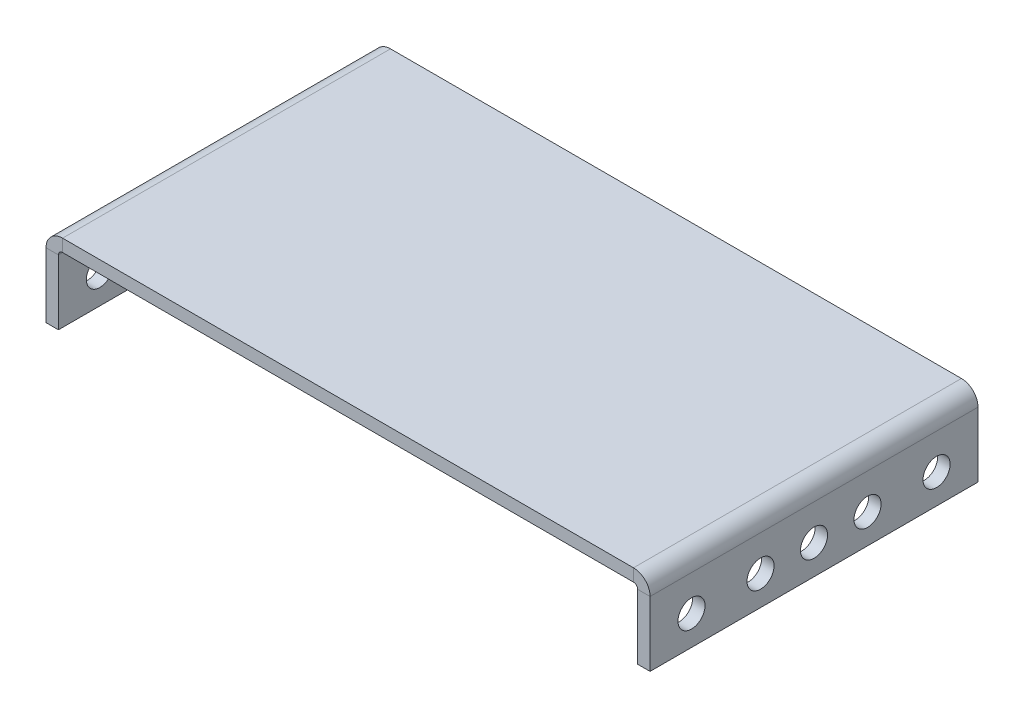
ISO-10303-21;
HEADER;
FILE_DESCRIPTION(('STEP AP214'),'2;1');
FILE_NAME('part.step','',(''),(''),'','','');
FILE_SCHEMA(('AUTOMOTIVE_DESIGN { 1 0 10303 214 1 1 1 1 }'));
ENDSEC;
DATA;
#1=APPLICATION_CONTEXT('core data for automotive mechanical design processes');
#2=APPLICATION_PROTOCOL_DEFINITION('international standard','automotive_design',2000,#1);
#3=PRODUCT_CONTEXT('',#1,'mechanical');
#4=PRODUCT('Part','Part','',(#3));
#5=PRODUCT_RELATED_PRODUCT_CATEGORY('part','',(#4));
#6=PRODUCT_DEFINITION_FORMATION('','',#4);
#7=PRODUCT_DEFINITION_CONTEXT('part definition',#1,'design');
#8=PRODUCT_DEFINITION('design','',#6,#7);
#9=PRODUCT_DEFINITION_SHAPE('','',#8);
#10=(LENGTH_UNIT() NAMED_UNIT(*) SI_UNIT(.MILLI.,.METRE.));
#11=(NAMED_UNIT(*) PLANE_ANGLE_UNIT() SI_UNIT($,.RADIAN.));
#12=(NAMED_UNIT(*) SI_UNIT($,.STERADIAN.) SOLID_ANGLE_UNIT());
#13=UNCERTAINTY_MEASURE_WITH_UNIT(LENGTH_MEASURE(1.E-05),#10,'distance_accuracy_value','');
#14=(GEOMETRIC_REPRESENTATION_CONTEXT(3) GLOBAL_UNCERTAINTY_ASSIGNED_CONTEXT((#13)) GLOBAL_UNIT_ASSIGNED_CONTEXT((#10,
#11,#12)) REPRESENTATION_CONTEXT('',''));
#15=CARTESIAN_POINT('',(0.,0.,0.));
#16=DIRECTION('',(0.,0.,1.));
#17=DIRECTION('',(1.,0.,0.));
#18=AXIS2_PLACEMENT_3D('',#15,#16,#17);
#19=CARTESIAN_POINT('',(52.5145,6.34999999999999,60.325));
#20=DIRECTION('',(0.,0.,1.));
#21=DIRECTION('',(1.,0.,0.));
#22=AXIS2_PLACEMENT_3D('',#19,#20,#21);
#23=PLANE('',#22);
#24=DIRECTION('',(0.,1.,0.));
#25=VECTOR('',#24,1.);
#26=CARTESIAN_POINT('',(52.5145,6.34999999999999,60.325));
#27=LINE('',#26,#25);
#28=CARTESIAN_POINT('',(52.5145,6.34999999999999,60.325));
#29=VERTEX_POINT('',#28);
#30=CARTESIAN_POINT('',(52.5145,8.63599999999999,60.325));
#31=VERTEX_POINT('',#30);
#32=EDGE_CURVE('E11',#29,#31,#27,.T.);
#33=ORIENTED_EDGE('',*,*,#32,.F.);
#34=CARTESIAN_POINT('',(52.5145,5.58799999999999,60.325));
#35=DIRECTION('',(0.,0.,-1.));
#36=DIRECTION('',(-1.,0.,0.));
#37=AXIS2_PLACEMENT_3D('',#34,#35,#36);
#38=CIRCLE('',#37,0.762);
#39=CARTESIAN_POINT('',(53.2765,5.58799999999999,60.325));
#40=VERTEX_POINT('',#39);
#41=EDGE_CURVE('E252',#40,#29,#38,.F.);
#42=ORIENTED_EDGE('',*,*,#41,.F.);
#43=DIRECTION('',(-1.,0.,0.));
#44=VECTOR('',#43,1.);
#45=CARTESIAN_POINT('',(55.5625,5.58799999999999,60.325));
#46=LINE('',#45,#44);
#47=CARTESIAN_POINT('',(55.5625,5.58799999999999,60.325));
#48=VERTEX_POINT('',#47);
#49=EDGE_CURVE('E49',#48,#40,#46,.T.);
#50=ORIENTED_EDGE('',*,*,#49,.F.);
#51=CARTESIAN_POINT('',(52.5145,5.58799999999999,60.325));
#52=DIRECTION('',(0.,0.,1.));
#53=DIRECTION('',(1.,0.,0.));
#54=AXIS2_PLACEMENT_3D('',#51,#52,#53);
#55=CIRCLE('',#54,3.048);
#56=EDGE_CURVE('E150',#48,#31,#55,.T.);
#57=ORIENTED_EDGE('',*,*,#56,.T.);
#58=EDGE_LOOP('',(#33,#42,#50,#57));
#59=FACE_BOUND('',#58,.T.);
#60=ADVANCED_FACE('F41',(#59),#23,.T.);
#61=CARTESIAN_POINT('',(55.5625,5.58799999999999,60.325));
#62=DIRECTION('',(0.,0.,1.));
#63=DIRECTION('',(1.,0.,0.));
#64=AXIS2_PLACEMENT_3D('',#61,#62,#63);
#65=PLANE('',#64);
#66=DIRECTION('',(-1.,0.,0.));
#67=VECTOR('',#66,1.);
#68=CARTESIAN_POINT('',(-53.2765,6.35,60.325));
#69=LINE('',#68,#67);
#70=CARTESIAN_POINT('',(-52.5145,6.35,60.325));
#71=VERTEX_POINT('',#70);
#72=EDGE_CURVE('E144',#29,#71,#69,.T.);
#73=ORIENTED_EDGE('',*,*,#72,.F.);
#74=ORIENTED_EDGE('',*,*,#32,.T.);
#75=DIRECTION('',(-1.,0.,0.));
#76=VECTOR('',#75,1.);
#77=CARTESIAN_POINT('',(-53.2765,8.636,60.325));
#78=LINE('',#77,#76);
#79=CARTESIAN_POINT('',(-52.5145,8.636,60.325));
#80=VERTEX_POINT('',#79);
#81=EDGE_CURVE('E141',#31,#80,#78,.T.);
#82=ORIENTED_EDGE('',*,*,#81,.T.);
#83=DIRECTION('',(0.,-1.,0.));
#84=VECTOR('',#83,1.);
#85=CARTESIAN_POINT('',(-52.5145,8.636,60.325));
#86=LINE('',#85,#84);
#87=EDGE_CURVE('E233',#80,#71,#86,.T.);
#88=ORIENTED_EDGE('',*,*,#87,.T.);
#89=EDGE_LOOP('',(#73,#74,#82,#88));
#90=FACE_BOUND('',#89,.T.);
#91=ADVANCED_FACE('F139',(#90),#65,.T.);
#92=CARTESIAN_POINT('',(53.2765,5.58799999999999,0.));
#93=DIRECTION('',(0.,0.,-1.));
#94=DIRECTION('',(-1.,0.,0.));
#95=AXIS2_PLACEMENT_3D('',#92,#93,#94);
#96=PLANE('',#95);
#97=DIRECTION('',(1.,0.,0.));
#98=VECTOR('',#97,1.);
#99=CARTESIAN_POINT('',(53.2765,5.58799999999999,0.));
#100=LINE('',#99,#98);
#101=CARTESIAN_POINT('',(53.2765,5.58799999999999,0.));
#102=VERTEX_POINT('',#101);
#103=CARTESIAN_POINT('',(55.5625,5.58799999999999,0.));
#104=VERTEX_POINT('',#103);
#105=EDGE_CURVE('E238',#102,#104,#100,.T.);
#106=ORIENTED_EDGE('',*,*,#105,.F.);
#107=CARTESIAN_POINT('',(52.5145,5.58799999999999,0.));
#108=DIRECTION('',(0.,0.,-1.));
#109=DIRECTION('',(-1.,0.,0.));
#110=AXIS2_PLACEMENT_3D('',#107,#108,#109);
#111=CIRCLE('',#110,0.762);
#112=CARTESIAN_POINT('',(52.5145,6.34999999999999,0.));
#113=VERTEX_POINT('',#112);
#114=EDGE_CURVE('E190',#102,#113,#111,.F.);
#115=ORIENTED_EDGE('',*,*,#114,.T.);
#116=DIRECTION('',(0.,-1.,0.));
#117=VECTOR('',#116,1.);
#118=CARTESIAN_POINT('',(52.5145,8.63599999999999,0.));
#119=LINE('',#118,#117);
#120=CARTESIAN_POINT('',(52.5145,8.63599999999999,0.));
#121=VERTEX_POINT('',#120);
#122=EDGE_CURVE('E236',#121,#113,#119,.T.);
#123=ORIENTED_EDGE('',*,*,#122,.F.);
#124=CARTESIAN_POINT('',(52.5145,5.58799999999999,0.));
#125=DIRECTION('',(0.,0.,1.));
#126=DIRECTION('',(1.,0.,0.));
#127=AXIS2_PLACEMENT_3D('',#124,#125,#126);
#128=CIRCLE('',#127,3.048);
#129=EDGE_CURVE('E162',#104,#121,#128,.T.);
#130=ORIENTED_EDGE('',*,*,#129,.F.);
#131=EDGE_LOOP('',(#106,#115,#123,#130));
#132=FACE_BOUND('',#131,.T.);
#133=ADVANCED_FACE('F360',(#132),#96,.T.);
#134=CARTESIAN_POINT('',(52.5145,8.63599999999999,0.));
#135=DIRECTION('',(0.,0.,-1.));
#136=DIRECTION('',(-1.,0.,0.));
#137=AXIS2_PLACEMENT_3D('',#134,#135,#136);
#138=PLANE('',#137);
#139=DIRECTION('',(0.,1.,0.));
#140=VECTOR('',#139,1.);
#141=CARTESIAN_POINT('',(53.2765,6.34999999999999,0.));
#142=LINE('',#141,#140);
#143=CARTESIAN_POINT('',(53.2765,-6.34999999999999,0.));
#144=VERTEX_POINT('',#143);
#145=EDGE_CURVE('E193',#144,#102,#142,.T.);
#146=ORIENTED_EDGE('',*,*,#145,.T.);
#147=ORIENTED_EDGE('',*,*,#105,.T.);
#148=DIRECTION('',(0.,1.,0.));
#149=VECTOR('',#148,1.);
#150=CARTESIAN_POINT('',(55.5625,6.34999999999999,0.));
#151=LINE('',#150,#149);
#152=CARTESIAN_POINT('',(55.5625,-6.34999999999999,0.));
#153=VERTEX_POINT('',#152);
#154=EDGE_CURVE('E199',#153,#104,#151,.T.);
#155=ORIENTED_EDGE('',*,*,#154,.F.);
#156=DIRECTION('',(-1.,0.,0.));
#157=VECTOR('',#156,1.);
#158=CARTESIAN_POINT('',(55.5625,-6.34999999999999,0.));
#159=LINE('',#158,#157);
#160=EDGE_CURVE('E196',#153,#144,#159,.T.);
#161=ORIENTED_EDGE('',*,*,#160,.T.);
#162=EDGE_LOOP('',(#146,#147,#155,#161));
#163=FACE_BOUND('',#162,.T.);
#164=ADVANCED_FACE('F364',(#163),#138,.T.);
#165=CARTESIAN_POINT('',(-53.2765,5.588,60.325));
#166=DIRECTION('',(0.,0.,1.));
#167=DIRECTION('',(1.,0.,0.));
#168=AXIS2_PLACEMENT_3D('',#165,#166,#167);
#169=PLANE('',#168);
#170=DIRECTION('',(-1.,0.,0.));
#171=VECTOR('',#170,1.);
#172=CARTESIAN_POINT('',(-53.2765,5.588,60.325));
#173=LINE('',#172,#171);
#174=CARTESIAN_POINT('',(-53.2765,5.588,60.325));
#175=VERTEX_POINT('',#174);
#176=CARTESIAN_POINT('',(-55.5625,5.588,60.325));
#177=VERTEX_POINT('',#176);
#178=EDGE_CURVE('E57',#175,#177,#173,.T.);
#179=ORIENTED_EDGE('',*,*,#178,.F.);
#180=CARTESIAN_POINT('',(-52.5145,5.588,60.325));
#181=DIRECTION('',(0.,0.,-1.));
#182=DIRECTION('',(-1.,0.,0.));
#183=AXIS2_PLACEMENT_3D('',#180,#181,#182);
#184=CIRCLE('',#183,0.762);
#185=EDGE_CURVE('E262',#71,#175,#184,.F.);
#186=ORIENTED_EDGE('',*,*,#185,.F.);
#187=ORIENTED_EDGE('',*,*,#87,.F.);
#188=CARTESIAN_POINT('',(-52.5145,5.588,60.325));
#189=DIRECTION('',(0.,0.,1.));
#190=DIRECTION('',(1.,0.,0.));
#191=AXIS2_PLACEMENT_3D('',#188,#189,#190);
#192=CIRCLE('',#191,3.048);
#193=EDGE_CURVE('E170',#80,#177,#192,.T.);
#194=ORIENTED_EDGE('',*,*,#193,.T.);
#195=EDGE_LOOP('',(#179,#186,#187,#194));
#196=FACE_BOUND('',#195,.T.);
#197=ADVANCED_FACE('F370',(#196),#169,.T.);
#198=CARTESIAN_POINT('',(-52.5145,8.636,60.325));
#199=DIRECTION('',(0.,0.,1.));
#200=DIRECTION('',(1.,0.,0.));
#201=AXIS2_PLACEMENT_3D('',#198,#199,#200);
#202=PLANE('',#201);
#203=DIRECTION('',(0.,-1.,0.));
#204=VECTOR('',#203,1.);
#205=CARTESIAN_POINT('',(-53.2765,6.35,60.325));
#206=LINE('',#205,#204);
#207=CARTESIAN_POINT('',(-53.2765,-6.35,60.325));
#208=VERTEX_POINT('',#207);
#209=EDGE_CURVE('E265',#175,#208,#206,.T.);
#210=ORIENTED_EDGE('',*,*,#209,.F.);
#211=ORIENTED_EDGE('',*,*,#178,.T.);
#212=DIRECTION('',(0.,1.,0.));
#213=VECTOR('',#212,1.);
#214=CARTESIAN_POINT('',(-55.5625,6.35,60.325));
#215=LINE('',#214,#213);
#216=CARTESIAN_POINT('',(-55.5625,-6.35,60.325));
#217=VERTEX_POINT('',#216);
#218=EDGE_CURVE('E111',#177,#217,#215,.F.);
#219=ORIENTED_EDGE('',*,*,#218,.T.);
#220=DIRECTION('',(-1.,0.,0.));
#221=VECTOR('',#220,1.);
#222=CARTESIAN_POINT('',(-53.2765,-6.35,60.325));
#223=LINE('',#222,#221);
#224=EDGE_CURVE('E268',#208,#217,#223,.T.);
#225=ORIENTED_EDGE('',*,*,#224,.F.);
#226=EDGE_LOOP('',(#210,#211,#219,#225));
#227=FACE_BOUND('',#226,.T.);
#228=ADVANCED_FACE('F374',(#227),#202,.T.);
#229=CARTESIAN_POINT('',(-52.5145,6.35,0.));
#230=DIRECTION('',(0.,0.,-1.));
#231=DIRECTION('',(-1.,0.,0.));
#232=AXIS2_PLACEMENT_3D('',#229,#230,#231);
#233=PLANE('',#232);
#234=DIRECTION('',(0.,1.,0.));
#235=VECTOR('',#234,1.);
#236=CARTESIAN_POINT('',(-52.5145,6.35,0.));
#237=LINE('',#236,#235);
#238=CARTESIAN_POINT('',(-52.5145,6.35,0.));
#239=VERTEX_POINT('',#238);
#240=CARTESIAN_POINT('',(-52.5145,8.636,0.));
#241=VERTEX_POINT('',#240);
#242=EDGE_CURVE('E98',#239,#241,#237,.T.);
#243=ORIENTED_EDGE('',*,*,#242,.F.);
#244=CARTESIAN_POINT('',(-52.5145,5.588,0.));
#245=DIRECTION('',(0.,0.,-1.));
#246=DIRECTION('',(-1.,0.,0.));
#247=AXIS2_PLACEMENT_3D('',#244,#245,#246);
#248=CIRCLE('',#247,0.762);
#249=CARTESIAN_POINT('',(-53.2765,5.588,0.));
#250=VERTEX_POINT('',#249);
#251=EDGE_CURVE('E186',#239,#250,#248,.F.);
#252=ORIENTED_EDGE('',*,*,#251,.T.);
#253=DIRECTION('',(1.,0.,0.));
#254=VECTOR('',#253,1.);
#255=CARTESIAN_POINT('',(-55.5625,5.588,0.));
#256=LINE('',#255,#254);
#257=CARTESIAN_POINT('',(-55.5625,5.588,0.));
#258=VERTEX_POINT('',#257);
#259=EDGE_CURVE('E105',#258,#250,#256,.T.);
#260=ORIENTED_EDGE('',*,*,#259,.F.);
#261=CARTESIAN_POINT('',(-52.5145,5.588,0.));
#262=DIRECTION('',(0.,0.,1.));
#263=DIRECTION('',(1.,0.,0.));
#264=AXIS2_PLACEMENT_3D('',#261,#262,#263);
#265=CIRCLE('',#264,3.048);
#266=EDGE_CURVE('E205',#241,#258,#265,.T.);
#267=ORIENTED_EDGE('',*,*,#266,.F.);
#268=EDGE_LOOP('',(#243,#252,#260,#267));
#269=FACE_BOUND('',#268,.T.);
#270=ADVANCED_FACE('F378',(#269),#233,.T.);
#271=CARTESIAN_POINT('',(-55.5625,5.588,0.));
#272=DIRECTION('',(0.,0.,-1.));
#273=DIRECTION('',(-1.,0.,0.));
#274=AXIS2_PLACEMENT_3D('',#271,#272,#273);
#275=PLANE('',#274);
#276=DIRECTION('',(-1.,0.,0.));
#277=VECTOR('',#276,1.);
#278=CARTESIAN_POINT('',(-53.2765,6.35,0.));
#279=LINE('',#278,#277);
#280=EDGE_CURVE('E188',#113,#239,#279,.T.);
#281=ORIENTED_EDGE('',*,*,#280,.T.);
#282=ORIENTED_EDGE('',*,*,#242,.T.);
#283=DIRECTION('',(-1.,0.,0.));
#284=VECTOR('',#283,1.);
#285=CARTESIAN_POINT('',(-53.2765,8.636,0.));
#286=LINE('',#285,#284);
#287=EDGE_CURVE('E203',#121,#241,#286,.T.);
#288=ORIENTED_EDGE('',*,*,#287,.F.);
#289=ORIENTED_EDGE('',*,*,#122,.T.);
#290=EDGE_LOOP('',(#281,#282,#288,#289));
#291=FACE_BOUND('',#290,.T.);
#292=ADVANCED_FACE('F381',(#291),#275,.T.);
#293=CARTESIAN_POINT('',(-55.5625,6.35,60.325));
#294=DIRECTION('',(1.,0.,0.));
#295=DIRECTION('',(0.,0.,-1.));
#296=AXIS2_PLACEMENT_3D('',#293,#294,#295);
#297=PLANE('',#296);
#298=CARTESIAN_POINT('',(-55.5625,-0.922020000000005,40.005));
#299=DIRECTION('',(1.,0.,0.));
#300=DIRECTION('',(0.,0.,1.));
#301=AXIS2_PLACEMENT_3D('',#298,#299,#300);
#302=CIRCLE('',#301,2.4892);
#303=CARTESIAN_POINT('',(-55.5625,-0.922020000000005,42.4942));
#304=VERTEX_POINT('',#303);
#305=EDGE_CURVE('E312',#304,#304,#302,.T.);
#306=ORIENTED_EDGE('',*,*,#305,.T.);
#307=EDGE_LOOP('',(#306));
#308=FACE_BOUND('',#307,.T.);
#309=CARTESIAN_POINT('',(-55.5625,-0.922020000000008,52.705));
#310=DIRECTION('',(1.,0.,0.));
#311=DIRECTION('',(0.,0.,1.));
#312=AXIS2_PLACEMENT_3D('',#309,#310,#311);
#313=CIRCLE('',#312,2.4892);
#314=CARTESIAN_POINT('',(-55.5625,-0.922020000000008,55.1942));
#315=VERTEX_POINT('',#314);
#316=EDGE_CURVE('E311',#315,#315,#313,.T.);
#317=ORIENTED_EDGE('',*,*,#316,.T.);
#318=EDGE_LOOP('',(#317));
#319=FACE_BOUND('',#318,.T.);
#320=CARTESIAN_POINT('',(-55.5625,-0.922020000000003,7.62));
#321=DIRECTION('',(1.,0.,0.));
#322=DIRECTION('',(0.,0.,-1.));
#323=AXIS2_PLACEMENT_3D('',#320,#321,#322);
#324=CIRCLE('',#323,2.4892);
#325=CARTESIAN_POINT('',(-55.5625,-0.922020000000003,5.1308));
#326=VERTEX_POINT('',#325);
#327=EDGE_CURVE('E318',#326,#326,#324,.T.);
#328=ORIENTED_EDGE('',*,*,#327,.T.);
#329=EDGE_LOOP('',(#328));
#330=FACE_BOUND('',#329,.T.);
#331=CARTESIAN_POINT('',(-55.5625,-0.922020000000003,20.32));
#332=DIRECTION('',(1.,0.,0.));
#333=DIRECTION('',(0.,0.,-1.));
#334=AXIS2_PLACEMENT_3D('',#331,#332,#333);
#335=CIRCLE('',#334,2.4892);
#336=CARTESIAN_POINT('',(-55.5625,-0.922020000000003,17.8308));
#337=VERTEX_POINT('',#336);
#338=EDGE_CURVE('E324',#337,#337,#335,.T.);
#339=ORIENTED_EDGE('',*,*,#338,.T.);
#340=EDGE_LOOP('',(#339));
#341=FACE_BOUND('',#340,.T.);
#342=CARTESIAN_POINT('',(-55.5625,-0.922020000000003,30.1625));
#343=DIRECTION('',(1.,0.,0.));
#344=DIRECTION('',(0.,0.,-1.));
#345=AXIS2_PLACEMENT_3D('',#342,#343,#344);
#346=CIRCLE('',#345,2.4892);
#347=CARTESIAN_POINT('',(-55.5625,-0.922020000000003,27.6733));
#348=VERTEX_POINT('',#347);
#349=EDGE_CURVE('E301',#348,#348,#346,.T.);
#350=ORIENTED_EDGE('',*,*,#349,.T.);
#351=EDGE_LOOP('',(#350));
#352=FACE_BOUND('',#351,.T.);
#353=DIRECTION('',(0.,1.,0.));
#354=VECTOR('',#353,1.);
#355=CARTESIAN_POINT('',(-55.5625,6.35,0.));
#356=LINE('',#355,#354);
#357=CARTESIAN_POINT('',(-55.5625,-6.35,0.));
#358=VERTEX_POINT('',#357);
#359=EDGE_CURVE('E176',#258,#358,#356,.F.);
#360=ORIENTED_EDGE('',*,*,#359,.T.);
#361=DIRECTION('',(0.,0.,-1.));
#362=VECTOR('',#361,1.);
#363=CARTESIAN_POINT('',(-55.5625,-6.35,60.325));
#364=LINE('',#363,#362);
#365=EDGE_CURVE('E229',#217,#358,#364,.T.);
#366=ORIENTED_EDGE('',*,*,#365,.F.);
#367=ORIENTED_EDGE('',*,*,#218,.F.);
#368=DIRECTION('',(0.,0.,-1.));
#369=VECTOR('',#368,1.);
#370=CARTESIAN_POINT('',(-55.5625,5.588,60.325));
#371=LINE('',#370,#369);
#372=EDGE_CURVE('E172',#177,#258,#371,.T.);
#373=ORIENTED_EDGE('',*,*,#372,.T.);
#374=EDGE_LOOP('',(#360,#366,#367,#373));
#375=FACE_BOUND('',#374,.T.);
#376=ADVANCED_FACE('F332',(#308,#319,#330,#341,#352,#375),#297,.F.);
#377=CARTESIAN_POINT('',(-53.2765,-6.35,60.325));
#378=DIRECTION('',(0.,-1.,0.));
#379=DIRECTION('',(0.,0.,-1.));
#380=AXIS2_PLACEMENT_3D('',#377,#378,#379);
#381=PLANE('',#380);
#382=DIRECTION('',(-1.,0.,0.));
#383=VECTOR('',#382,1.);
#384=CARTESIAN_POINT('',(-53.2765,-6.35,0.));
#385=LINE('',#384,#383);
#386=CARTESIAN_POINT('',(-53.2765,-6.35,0.));
#387=VERTEX_POINT('',#386);
#388=EDGE_CURVE('E179',#387,#358,#385,.T.);
#389=ORIENTED_EDGE('',*,*,#388,.F.);
#390=DIRECTION('',(0.,0.,-1.));
#391=VECTOR('',#390,1.);
#392=CARTESIAN_POINT('',(-53.2765,-6.35,60.325));
#393=LINE('',#392,#391);
#394=EDGE_CURVE('E227',#208,#387,#393,.T.);
#395=ORIENTED_EDGE('',*,*,#394,.F.);
#396=ORIENTED_EDGE('',*,*,#224,.T.);
#397=ORIENTED_EDGE('',*,*,#365,.T.);
#398=EDGE_LOOP('',(#389,#395,#396,#397));
#399=FACE_BOUND('',#398,.T.);
#400=ADVANCED_FACE('F386',(#399),#381,.T.);
#401=CARTESIAN_POINT('',(-53.2765,6.35,60.325));
#402=DIRECTION('',(1.,0.,0.));
#403=DIRECTION('',(0.,0.,-1.));
#404=AXIS2_PLACEMENT_3D('',#401,#402,#403);
#405=PLANE('',#404);
#406=CARTESIAN_POINT('',(-53.2765,-0.922020000000005,40.005));
#407=DIRECTION('',(1.,0.,0.));
#408=DIRECTION('',(0.,0.,-1.));
#409=AXIS2_PLACEMENT_3D('',#406,#407,#408);
#410=CIRCLE('',#409,2.4892);
#411=CARTESIAN_POINT('',(-53.2765,-0.922020000000005,37.5158));
#412=VERTEX_POINT('',#411);
#413=EDGE_CURVE('E180',#412,#412,#410,.T.);
#414=ORIENTED_EDGE('',*,*,#413,.F.);
#415=EDGE_LOOP('',(#414));
#416=FACE_BOUND('',#415,.T.);
#417=CARTESIAN_POINT('',(-53.2765,-0.922020000000008,52.705));
#418=DIRECTION('',(1.,0.,0.));
#419=DIRECTION('',(0.,0.,-1.));
#420=AXIS2_PLACEMENT_3D('',#417,#418,#419);
#421=CIRCLE('',#420,2.4892);
#422=CARTESIAN_POINT('',(-53.2765,-0.922020000000008,50.2158));
#423=VERTEX_POINT('',#422);
#424=EDGE_CURVE('E277',#423,#423,#421,.T.);
#425=ORIENTED_EDGE('',*,*,#424,.F.);
#426=EDGE_LOOP('',(#425));
#427=FACE_BOUND('',#426,.T.);
#428=CARTESIAN_POINT('',(-53.2765,-0.922020000000003,7.62));
#429=DIRECTION('',(1.,0.,0.));
#430=DIRECTION('',(0.,0.,-1.));
#431=AXIS2_PLACEMENT_3D('',#428,#429,#430);
#432=CIRCLE('',#431,2.4892);
#433=CARTESIAN_POINT('',(-53.2765,-0.922020000000003,5.1308));
#434=VERTEX_POINT('',#433);
#435=EDGE_CURVE('E283',#434,#434,#432,.T.);
#436=ORIENTED_EDGE('',*,*,#435,.F.);
#437=EDGE_LOOP('',(#436));
#438=FACE_BOUND('',#437,.T.);
#439=CARTESIAN_POINT('',(-53.2765,-0.922020000000003,20.32));
#440=DIRECTION('',(1.,0.,0.));
#441=DIRECTION('',(0.,0.,-1.));
#442=AXIS2_PLACEMENT_3D('',#439,#440,#441);
#443=CIRCLE('',#442,2.4892);
#444=CARTESIAN_POINT('',(-53.2765,-0.922020000000003,17.8308));
#445=VERTEX_POINT('',#444);
#446=EDGE_CURVE('E289',#445,#445,#443,.T.);
#447=ORIENTED_EDGE('',*,*,#446,.F.);
#448=EDGE_LOOP('',(#447));
#449=FACE_BOUND('',#448,.T.);
#450=CARTESIAN_POINT('',(-53.2765,-0.922020000000003,30.1625));
#451=DIRECTION('',(1.,0.,0.));
#452=DIRECTION('',(0.,0.,-1.));
#453=AXIS2_PLACEMENT_3D('',#450,#451,#452);
#454=CIRCLE('',#453,2.4892);
#455=CARTESIAN_POINT('',(-53.2765,-0.922020000000003,27.6733));
#456=VERTEX_POINT('',#455);
#457=EDGE_CURVE('E295',#456,#456,#454,.T.);
#458=ORIENTED_EDGE('',*,*,#457,.F.);
#459=EDGE_LOOP('',(#458));
#460=FACE_BOUND('',#459,.T.);
#461=DIRECTION('',(0.,-1.,0.));
#462=VECTOR('',#461,1.);
#463=CARTESIAN_POINT('',(-53.2765,6.35,0.));
#464=LINE('',#463,#462);
#465=EDGE_CURVE('E183',#250,#387,#464,.T.);
#466=ORIENTED_EDGE('',*,*,#465,.F.);
#467=DIRECTION('',(0.,0.,-1.));
#468=VECTOR('',#467,1.);
#469=CARTESIAN_POINT('',(-53.2765,5.588,60.325));
#470=LINE('',#469,#468);
#471=EDGE_CURVE('E224',#175,#250,#470,.T.);
#472=ORIENTED_EDGE('',*,*,#471,.F.);
#473=ORIENTED_EDGE('',*,*,#209,.T.);
#474=ORIENTED_EDGE('',*,*,#394,.T.);
#475=EDGE_LOOP('',(#466,#472,#473,#474));
#476=FACE_BOUND('',#475,.T.);
#477=ADVANCED_FACE('F390',(#416,#427,#438,#449,#460,#476),#405,.T.);
#478=CARTESIAN_POINT('',(-52.5145,5.588,60.325));
#479=DIRECTION('',(0.,0.,-1.));
#480=DIRECTION('',(-1.,0.,0.));
#481=AXIS2_PLACEMENT_3D('',#478,#479,#480);
#482=CYLINDRICAL_SURFACE('',#481,0.762);
#483=ORIENTED_EDGE('',*,*,#251,.F.);
#484=DIRECTION('',(0.,0.,-1.));
#485=VECTOR('',#484,1.);
#486=CARTESIAN_POINT('',(-52.5145,6.35,60.325));
#487=LINE('',#486,#485);
#488=EDGE_CURVE('E221',#71,#239,#487,.T.);
#489=ORIENTED_EDGE('',*,*,#488,.F.);
#490=ORIENTED_EDGE('',*,*,#185,.T.);
#491=ORIENTED_EDGE('',*,*,#471,.T.);
#492=EDGE_LOOP('',(#483,#489,#490,#491));
#493=FACE_BOUND('',#492,.T.);
#494=ADVANCED_FACE('F394',(#493),#482,.F.);
#495=CARTESIAN_POINT('',(-53.2765,6.35,60.325));
#496=DIRECTION('',(0.,-1.,0.));
#497=DIRECTION('',(1.,0.,0.));
#498=AXIS2_PLACEMENT_3D('',#495,#496,#497);
#499=PLANE('',#498);
#500=ORIENTED_EDGE('',*,*,#280,.F.);
#501=DIRECTION('',(0.,0.,-1.));
#502=VECTOR('',#501,1.);
#503=CARTESIAN_POINT('',(52.5145,6.34999999999999,60.325));
#504=LINE('',#503,#502);
#505=EDGE_CURVE('E218',#29,#113,#504,.T.);
#506=ORIENTED_EDGE('',*,*,#505,.F.);
#507=ORIENTED_EDGE('',*,*,#72,.T.);
#508=ORIENTED_EDGE('',*,*,#488,.T.);
#509=EDGE_LOOP('',(#500,#506,#507,#508));
#510=FACE_BOUND('',#509,.T.);
#511=ADVANCED_FACE('F398',(#510),#499,.T.);
#512=CARTESIAN_POINT('',(52.5145,5.58799999999999,60.325));
#513=DIRECTION('',(0.,0.,-1.));
#514=DIRECTION('',(-1.,0.,0.));
#515=AXIS2_PLACEMENT_3D('',#512,#513,#514);
#516=CYLINDRICAL_SURFACE('',#515,0.762);
#517=ORIENTED_EDGE('',*,*,#114,.F.);
#518=DIRECTION('',(0.,0.,-1.));
#519=VECTOR('',#518,1.);
#520=CARTESIAN_POINT('',(53.2765,5.58799999999999,60.325));
#521=LINE('',#520,#519);
#522=EDGE_CURVE('E215',#40,#102,#521,.T.);
#523=ORIENTED_EDGE('',*,*,#522,.F.);
#524=ORIENTED_EDGE('',*,*,#41,.T.);
#525=ORIENTED_EDGE('',*,*,#505,.T.);
#526=EDGE_LOOP('',(#517,#523,#524,#525));
#527=FACE_BOUND('',#526,.T.);
#528=ADVANCED_FACE('F251',(#527),#516,.F.);
#529=CARTESIAN_POINT('',(53.2765,6.34999999999999,60.325));
#530=DIRECTION('',(-1.,0.,0.));
#531=DIRECTION('',(0.,0.,1.));
#532=AXIS2_PLACEMENT_3D('',#529,#530,#531);
#533=PLANE('',#532);
#534=CARTESIAN_POINT('',(53.2765,-0.922020000000005,40.005));
#535=DIRECTION('',(-1.,0.,0.));
#536=DIRECTION('',(0.,0.,1.));
#537=AXIS2_PLACEMENT_3D('',#534,#535,#536);
#538=CIRCLE('',#537,2.4892);
#539=CARTESIAN_POINT('',(53.2765,-0.922020000000005,42.4942));
#540=VERTEX_POINT('',#539);
#541=EDGE_CURVE('E274',#540,#540,#538,.T.);
#542=ORIENTED_EDGE('',*,*,#541,.F.);
#543=EDGE_LOOP('',(#542));
#544=FACE_BOUND('',#543,.T.);
#545=CARTESIAN_POINT('',(53.2765,-0.922020000000008,52.705));
#546=DIRECTION('',(-1.,0.,0.));
#547=DIRECTION('',(0.,0.,1.));
#548=AXIS2_PLACEMENT_3D('',#545,#546,#547);
#549=CIRCLE('',#548,2.4892);
#550=CARTESIAN_POINT('',(53.2765,-0.922020000000008,55.1942));
#551=VERTEX_POINT('',#550);
#552=EDGE_CURVE('E280',#551,#551,#549,.T.);
#553=ORIENTED_EDGE('',*,*,#552,.F.);
#554=EDGE_LOOP('',(#553));
#555=FACE_BOUND('',#554,.T.);
#556=CARTESIAN_POINT('',(53.2765,-0.922020000000003,7.62));
#557=DIRECTION('',(-1.,0.,0.));
#558=DIRECTION('',(0.,0.,1.));
#559=AXIS2_PLACEMENT_3D('',#556,#557,#558);
#560=CIRCLE('',#559,2.4892);
#561=CARTESIAN_POINT('',(53.2765,-0.922020000000003,10.1092));
#562=VERTEX_POINT('',#561);
#563=EDGE_CURVE('E286',#562,#562,#560,.T.);
#564=ORIENTED_EDGE('',*,*,#563,.F.);
#565=EDGE_LOOP('',(#564));
#566=FACE_BOUND('',#565,.T.);
#567=CARTESIAN_POINT('',(53.2765,-0.922020000000003,20.32));
#568=DIRECTION('',(-1.,0.,0.));
#569=DIRECTION('',(0.,0.,1.));
#570=AXIS2_PLACEMENT_3D('',#567,#568,#569);
#571=CIRCLE('',#570,2.4892);
#572=CARTESIAN_POINT('',(53.2765,-0.922020000000003,22.8092));
#573=VERTEX_POINT('',#572);
#574=EDGE_CURVE('E292',#573,#573,#571,.T.);
#575=ORIENTED_EDGE('',*,*,#574,.F.);
#576=EDGE_LOOP('',(#575));
#577=FACE_BOUND('',#576,.T.);
#578=CARTESIAN_POINT('',(53.2765,-0.922020000000003,30.1625));
#579=DIRECTION('',(-1.,0.,0.));
#580=DIRECTION('',(0.,0.,1.));
#581=AXIS2_PLACEMENT_3D('',#578,#579,#580);
#582=CIRCLE('',#581,2.4892);
#583=CARTESIAN_POINT('',(53.2765,-0.922020000000003,32.6517));
#584=VERTEX_POINT('',#583);
#585=EDGE_CURVE('E298',#584,#584,#582,.T.);
#586=ORIENTED_EDGE('',*,*,#585,.F.);
#587=EDGE_LOOP('',(#586));
#588=FACE_BOUND('',#587,.T.);
#589=ORIENTED_EDGE('',*,*,#145,.F.);
#590=DIRECTION('',(0.,0.,-1.));
#591=VECTOR('',#590,1.);
#592=CARTESIAN_POINT('',(53.2765,-6.34999999999999,60.325));
#593=LINE('',#592,#591);
#594=CARTESIAN_POINT('',(53.2765,-6.34999999999999,60.325));
#595=VERTEX_POINT('',#594);
#596=EDGE_CURVE('E213',#595,#144,#593,.T.);
#597=ORIENTED_EDGE('',*,*,#596,.F.);
#598=DIRECTION('',(0.,1.,0.));
#599=VECTOR('',#598,1.);
#600=CARTESIAN_POINT('',(53.2765,6.34999999999999,60.325));
#601=LINE('',#600,#599);
#602=EDGE_CURVE('E245',#595,#40,#601,.T.);
#603=ORIENTED_EDGE('',*,*,#602,.T.);
#604=ORIENTED_EDGE('',*,*,#522,.T.);
#605=EDGE_LOOP('',(#589,#597,#603,#604));
#606=FACE_BOUND('',#605,.T.);
#607=ADVANCED_FACE('F256',(#544,#555,#566,#577,#588,#606),#533,.T.);
#608=CARTESIAN_POINT('',(55.5625,-6.34999999999999,60.325));
#609=DIRECTION('',(0.,-1.,0.));
#610=DIRECTION('',(0.,0.,-1.));
#611=AXIS2_PLACEMENT_3D('',#608,#609,#610);
#612=PLANE('',#611);
#613=ORIENTED_EDGE('',*,*,#160,.F.);
#614=DIRECTION('',(0.,0.,-1.));
#615=VECTOR('',#614,1.);
#616=CARTESIAN_POINT('',(55.5625,-6.34999999999999,60.325));
#617=LINE('',#616,#615);
#618=CARTESIAN_POINT('',(55.5625,-6.34999999999999,60.325));
#619=VERTEX_POINT('',#618);
#620=EDGE_CURVE('E211',#619,#153,#617,.T.);
#621=ORIENTED_EDGE('',*,*,#620,.F.);
#622=DIRECTION('',(-1.,0.,0.));
#623=VECTOR('',#622,1.);
#624=CARTESIAN_POINT('',(55.5625,-6.34999999999999,60.325));
#625=LINE('',#624,#623);
#626=EDGE_CURVE('E257',#619,#595,#625,.T.);
#627=ORIENTED_EDGE('',*,*,#626,.T.);
#628=ORIENTED_EDGE('',*,*,#596,.T.);
#629=EDGE_LOOP('',(#613,#621,#627,#628));
#630=FACE_BOUND('',#629,.T.);
#631=ADVANCED_FACE('F407',(#630),#612,.T.);
#632=CARTESIAN_POINT('',(55.5625,6.34999999999999,60.325));
#633=DIRECTION('',(-1.,0.,0.));
#634=DIRECTION('',(0.,0.,1.));
#635=AXIS2_PLACEMENT_3D('',#632,#633,#634);
#636=PLANE('',#635);
#637=CARTESIAN_POINT('',(55.5625,-0.922020000000005,40.005));
#638=DIRECTION('',(1.,0.,0.));
#639=DIRECTION('',(0.,0.,1.));
#640=AXIS2_PLACEMENT_3D('',#637,#638,#639);
#641=CIRCLE('',#640,2.4892);
#642=CARTESIAN_POINT('',(55.5625,-0.922020000000005,42.4942));
#643=VERTEX_POINT('',#642);
#644=EDGE_CURVE('E308',#643,#643,#641,.T.);
#645=ORIENTED_EDGE('',*,*,#644,.F.);
#646=EDGE_LOOP('',(#645));
#647=FACE_BOUND('',#646,.T.);
#648=CARTESIAN_POINT('',(55.5625,-0.922020000000008,52.705));
#649=DIRECTION('',(1.,0.,0.));
#650=DIRECTION('',(0.,0.,1.));
#651=AXIS2_PLACEMENT_3D('',#648,#649,#650);
#652=CIRCLE('',#651,2.4892);
#653=CARTESIAN_POINT('',(55.5625,-0.922020000000008,55.1942));
#654=VERTEX_POINT('',#653);
#655=EDGE_CURVE('E315',#654,#654,#652,.T.);
#656=ORIENTED_EDGE('',*,*,#655,.F.);
#657=EDGE_LOOP('',(#656));
#658=FACE_BOUND('',#657,.T.);
#659=CARTESIAN_POINT('',(55.5625,-0.922020000000003,7.62));
#660=DIRECTION('',(1.,0.,0.));
#661=DIRECTION('',(0.,0.,-1.));
#662=AXIS2_PLACEMENT_3D('',#659,#660,#661);
#663=CIRCLE('',#662,2.4892);
#664=CARTESIAN_POINT('',(55.5625,-0.922020000000003,5.1308));
#665=VERTEX_POINT('',#664);
#666=EDGE_CURVE('E321',#665,#665,#663,.T.);
#667=ORIENTED_EDGE('',*,*,#666,.F.);
#668=EDGE_LOOP('',(#667));
#669=FACE_BOUND('',#668,.T.);
#670=CARTESIAN_POINT('',(55.5625,-0.922020000000003,20.32));
#671=DIRECTION('',(1.,0.,0.));
#672=DIRECTION('',(0.,0.,-1.));
#673=AXIS2_PLACEMENT_3D('',#670,#671,#672);
#674=CIRCLE('',#673,2.4892);
#675=CARTESIAN_POINT('',(55.5625,-0.922020000000003,17.8308));
#676=VERTEX_POINT('',#675);
#677=EDGE_CURVE('E307',#676,#676,#674,.T.);
#678=ORIENTED_EDGE('',*,*,#677,.F.);
#679=EDGE_LOOP('',(#678));
#680=FACE_BOUND('',#679,.T.);
#681=CARTESIAN_POINT('',(55.5625,-0.922020000000003,30.1625));
#682=DIRECTION('',(1.,0.,0.));
#683=DIRECTION('',(0.,0.,-1.));
#684=AXIS2_PLACEMENT_3D('',#681,#682,#683);
#685=CIRCLE('',#684,2.4892);
#686=CARTESIAN_POINT('',(55.5625,-0.922020000000003,27.6733));
#687=VERTEX_POINT('',#686);
#688=EDGE_CURVE('E304',#687,#687,#685,.T.);
#689=ORIENTED_EDGE('',*,*,#688,.F.);
#690=EDGE_LOOP('',(#689));
#691=FACE_BOUND('',#690,.T.);
#692=ORIENTED_EDGE('',*,*,#154,.T.);
#693=DIRECTION('',(0.,0.,-1.));
#694=VECTOR('',#693,1.);
#695=CARTESIAN_POINT('',(55.5625,5.58799999999999,60.325));
#696=LINE('',#695,#694);
#697=EDGE_CURVE('E164',#48,#104,#696,.T.);
#698=ORIENTED_EDGE('',*,*,#697,.F.);
#699=DIRECTION('',(0.,1.,0.));
#700=VECTOR('',#699,1.);
#701=CARTESIAN_POINT('',(55.5625,6.34999999999999,60.325));
#702=LINE('',#701,#700);
#703=EDGE_CURVE('E155',#619,#48,#702,.T.);
#704=ORIENTED_EDGE('',*,*,#703,.F.);
#705=ORIENTED_EDGE('',*,*,#620,.T.);
#706=EDGE_LOOP('',(#692,#698,#704,#705));
#707=FACE_BOUND('',#706,.T.);
#708=ADVANCED_FACE('F411',(#647,#658,#669,#680,#691,#707),#636,.F.);
#709=CARTESIAN_POINT('',(52.5145,5.58799999999999,60.325));
#710=DIRECTION('',(0.,0.,-1.));
#711=DIRECTION('',(-1.,0.,0.));
#712=AXIS2_PLACEMENT_3D('',#709,#710,#711);
#713=CYLINDRICAL_SURFACE('',#712,3.048);
#714=ORIENTED_EDGE('',*,*,#129,.T.);
#715=DIRECTION('',(0.,0.,-1.));
#716=VECTOR('',#715,1.);
#717=CARTESIAN_POINT('',(52.5145,8.63599999999999,60.325));
#718=LINE('',#717,#716);
#719=EDGE_CURVE('E159',#31,#121,#718,.T.);
#720=ORIENTED_EDGE('',*,*,#719,.F.);
#721=ORIENTED_EDGE('',*,*,#56,.F.);
#722=ORIENTED_EDGE('',*,*,#697,.T.);
#723=EDGE_LOOP('',(#714,#720,#721,#722));
#724=FACE_BOUND('',#723,.T.);
#725=ADVANCED_FACE('F160',(#724),#713,.T.);
#726=CARTESIAN_POINT('',(-53.2765,8.636,60.325));
#727=DIRECTION('',(0.,-1.,0.));
#728=DIRECTION('',(1.,0.,0.));
#729=AXIS2_PLACEMENT_3D('',#726,#727,#728);
#730=PLANE('',#729);
#731=ORIENTED_EDGE('',*,*,#287,.T.);
#732=DIRECTION('',(0.,0.,-1.));
#733=VECTOR('',#732,1.);
#734=CARTESIAN_POINT('',(-52.5145,8.636,60.325));
#735=LINE('',#734,#733);
#736=EDGE_CURVE('E165',#80,#241,#735,.T.);
#737=ORIENTED_EDGE('',*,*,#736,.F.);
#738=ORIENTED_EDGE('',*,*,#81,.F.);
#739=ORIENTED_EDGE('',*,*,#719,.T.);
#740=EDGE_LOOP('',(#731,#737,#738,#739));
#741=FACE_BOUND('',#740,.T.);
#742=ADVANCED_FACE('F167',(#741),#730,.F.);
#743=CARTESIAN_POINT('',(-52.5145,5.588,60.325));
#744=DIRECTION('',(0.,0.,-1.));
#745=DIRECTION('',(-1.,0.,0.));
#746=AXIS2_PLACEMENT_3D('',#743,#744,#745);
#747=CYLINDRICAL_SURFACE('',#746,3.048);
#748=ORIENTED_EDGE('',*,*,#266,.T.);
#749=ORIENTED_EDGE('',*,*,#372,.F.);
#750=ORIENTED_EDGE('',*,*,#193,.F.);
#751=ORIENTED_EDGE('',*,*,#736,.T.);
#752=EDGE_LOOP('',(#748,#749,#750,#751));
#753=FACE_BOUND('',#752,.T.);
#754=ADVANCED_FACE('F420',(#753),#747,.T.);
#755=CARTESIAN_POINT('',(-52.5145,5.588,60.325));
#756=DIRECTION('',(0.,0.,-1.));
#757=DIRECTION('',(-1.,0.,0.));
#758=AXIS2_PLACEMENT_3D('',#755,#756,#757);
#759=PLANE('',#758);
#760=ORIENTED_EDGE('',*,*,#703,.T.);
#761=ORIENTED_EDGE('',*,*,#49,.T.);
#762=ORIENTED_EDGE('',*,*,#602,.F.);
#763=ORIENTED_EDGE('',*,*,#626,.F.);
#764=EDGE_LOOP('',(#760,#761,#762,#763));
#765=FACE_BOUND('',#764,.T.);
#766=ADVANCED_FACE('F242',(#765),#759,.F.);
#767=CARTESIAN_POINT('',(-52.5145,5.588,0.));
#768=DIRECTION('',(0.,0.,-1.));
#769=DIRECTION('',(-1.,0.,0.));
#770=AXIS2_PLACEMENT_3D('',#767,#768,#769);
#771=PLANE('',#770);
#772=ORIENTED_EDGE('',*,*,#359,.F.);
#773=ORIENTED_EDGE('',*,*,#259,.T.);
#774=ORIENTED_EDGE('',*,*,#465,.T.);
#775=ORIENTED_EDGE('',*,*,#388,.T.);
#776=EDGE_LOOP('',(#772,#773,#774,#775));
#777=FACE_BOUND('',#776,.T.);
#778=ADVANCED_FACE('F424',(#777),#771,.T.);
#779=CARTESIAN_POINT('',(-55.5625,-0.922020000000003,30.1625));
#780=DIRECTION('',(1.,0.,0.));
#781=DIRECTION('',(0.,0.,-1.));
#782=AXIS2_PLACEMENT_3D('',#779,#780,#781);
#783=CYLINDRICAL_SURFACE('',#782,2.4892);
#784=ORIENTED_EDGE('',*,*,#585,.T.);
#785=EDGE_LOOP('',(#784));
#786=FACE_BOUND('',#785,.T.);
#787=ORIENTED_EDGE('',*,*,#688,.T.);
#788=EDGE_LOOP('',(#787));
#789=FACE_BOUND('',#788,.T.);
#790=ADVANCED_FACE('F353',(#786,#789),#783,.F.);
#791=CARTESIAN_POINT('',(-55.5625,-0.922020000000003,20.32));
#792=DIRECTION('',(1.,0.,0.));
#793=DIRECTION('',(0.,0.,-1.));
#794=AXIS2_PLACEMENT_3D('',#791,#792,#793);
#795=CYLINDRICAL_SURFACE('',#794,2.4892);
#796=ORIENTED_EDGE('',*,*,#574,.T.);
#797=EDGE_LOOP('',(#796));
#798=FACE_BOUND('',#797,.T.);
#799=ORIENTED_EDGE('',*,*,#677,.T.);
#800=EDGE_LOOP('',(#799));
#801=FACE_BOUND('',#800,.T.);
#802=ADVANCED_FACE('F341',(#798,#801),#795,.F.);
#803=CARTESIAN_POINT('',(-55.5625,-0.922020000000003,7.62));
#804=DIRECTION('',(1.,0.,0.));
#805=DIRECTION('',(0.,0.,-1.));
#806=AXIS2_PLACEMENT_3D('',#803,#804,#805);
#807=CYLINDRICAL_SURFACE('',#806,2.4892);
#808=ORIENTED_EDGE('',*,*,#563,.T.);
#809=EDGE_LOOP('',(#808));
#810=FACE_BOUND('',#809,.T.);
#811=ORIENTED_EDGE('',*,*,#666,.T.);
#812=EDGE_LOOP('',(#811));
#813=FACE_BOUND('',#812,.T.);
#814=ADVANCED_FACE('F349',(#810,#813),#807,.F.);
#815=CARTESIAN_POINT('',(-55.5625,-0.922020000000008,52.705));
#816=DIRECTION('',(1.,0.,0.));
#817=DIRECTION('',(0.,0.,-1.));
#818=AXIS2_PLACEMENT_3D('',#815,#816,#817);
#819=CYLINDRICAL_SURFACE('',#818,2.4892);
#820=ORIENTED_EDGE('',*,*,#552,.T.);
#821=EDGE_LOOP('',(#820));
#822=FACE_BOUND('',#821,.T.);
#823=ORIENTED_EDGE('',*,*,#655,.T.);
#824=EDGE_LOOP('',(#823));
#825=FACE_BOUND('',#824,.T.);
#826=ADVANCED_FACE('F434',(#822,#825),#819,.F.);
#827=CARTESIAN_POINT('',(-55.5625,-0.922020000000005,40.005));
#828=DIRECTION('',(1.,0.,0.));
#829=DIRECTION('',(0.,0.,-1.));
#830=AXIS2_PLACEMENT_3D('',#827,#828,#829);
#831=CYLINDRICAL_SURFACE('',#830,2.4892);
#832=ORIENTED_EDGE('',*,*,#541,.T.);
#833=EDGE_LOOP('',(#832));
#834=FACE_BOUND('',#833,.T.);
#835=ORIENTED_EDGE('',*,*,#644,.T.);
#836=EDGE_LOOP('',(#835));
#837=FACE_BOUND('',#836,.T.);
#838=ADVANCED_FACE('F350',(#834,#837),#831,.F.);
#839=ORIENTED_EDGE('',*,*,#457,.T.);
#840=EDGE_LOOP('',(#839));
#841=FACE_BOUND('',#840,.T.);
#842=ORIENTED_EDGE('',*,*,#349,.F.);
#843=EDGE_LOOP('',(#842));
#844=FACE_BOUND('',#843,.T.);
#845=ADVANCED_FACE('F338',(#841,#844),#783,.F.);
#846=ORIENTED_EDGE('',*,*,#446,.T.);
#847=EDGE_LOOP('',(#846));
#848=FACE_BOUND('',#847,.T.);
#849=ORIENTED_EDGE('',*,*,#338,.F.);
#850=EDGE_LOOP('',(#849));
#851=FACE_BOUND('',#850,.T.);
#852=ADVANCED_FACE('F335',(#848,#851),#795,.F.);
#853=ORIENTED_EDGE('',*,*,#435,.T.);
#854=EDGE_LOOP('',(#853));
#855=FACE_BOUND('',#854,.T.);
#856=ORIENTED_EDGE('',*,*,#327,.F.);
#857=EDGE_LOOP('',(#856));
#858=FACE_BOUND('',#857,.T.);
#859=ADVANCED_FACE('F337',(#855,#858),#807,.F.);
#860=ORIENTED_EDGE('',*,*,#424,.T.);
#861=EDGE_LOOP('',(#860));
#862=FACE_BOUND('',#861,.T.);
#863=ORIENTED_EDGE('',*,*,#316,.F.);
#864=EDGE_LOOP('',(#863));
#865=FACE_BOUND('',#864,.T.);
#866=ADVANCED_FACE('F346',(#862,#865),#819,.F.);
#867=ORIENTED_EDGE('',*,*,#413,.T.);
#868=EDGE_LOOP('',(#867));
#869=FACE_BOUND('',#868,.T.);
#870=ORIENTED_EDGE('',*,*,#305,.F.);
#871=EDGE_LOOP('',(#870));
#872=FACE_BOUND('',#871,.T.);
#873=ADVANCED_FACE('F436',(#869,#872),#831,.F.);
#874=CLOSED_SHELL('',(#60,#91,#133,#164,#197,#228,#270,#292,#376,#400,#477,#494,#511,#528,#607,
#631,#708,#725,#742,#754,#766,#778,#790,#802,#814,#826,#838,#845,#852,#859,#866,#873));
#875=MANIFOLD_SOLID_BREP('B2',#874);
#876=ADVANCED_BREP_SHAPE_REPRESENTATION('',(#18,#875),#14);
#877=SHAPE_DEFINITION_REPRESENTATION(#9,#876);
ENDSEC;
END-ISO-10303-21;
